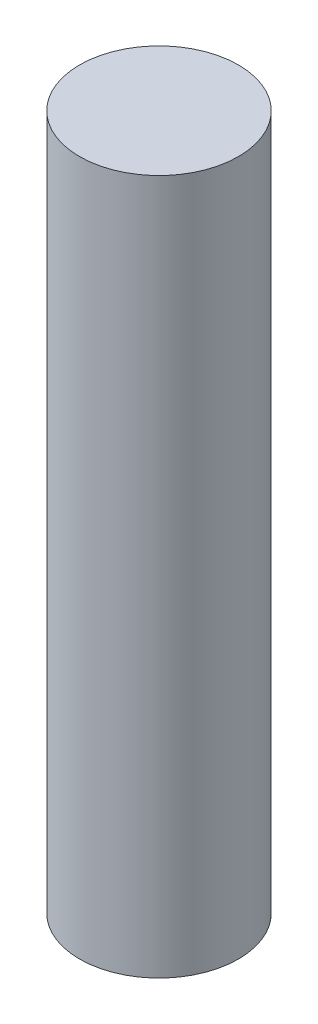
ISO-10303-21;
HEADER;
FILE_DESCRIPTION(('STEP AP214'),'2;1');
FILE_NAME('part.step','',(''),(''),'','','');
FILE_SCHEMA(('AUTOMOTIVE_DESIGN { 1 0 10303 214 1 1 1 1 }'));
ENDSEC;
DATA;
#1=APPLICATION_CONTEXT('core data for automotive mechanical design processes');
#2=APPLICATION_PROTOCOL_DEFINITION('international standard','automotive_design',2000,#1);
#3=PRODUCT_CONTEXT('',#1,'mechanical');
#4=PRODUCT('Part','Part','',(#3));
#5=PRODUCT_RELATED_PRODUCT_CATEGORY('part','',(#4));
#6=PRODUCT_DEFINITION_FORMATION('','',#4);
#7=PRODUCT_DEFINITION_CONTEXT('part definition',#1,'design');
#8=PRODUCT_DEFINITION('design','',#6,#7);
#9=PRODUCT_DEFINITION_SHAPE('','',#8);
#10=(LENGTH_UNIT() NAMED_UNIT(*) SI_UNIT(.MILLI.,.METRE.));
#11=(NAMED_UNIT(*) PLANE_ANGLE_UNIT() SI_UNIT($,.RADIAN.));
#12=(NAMED_UNIT(*) SI_UNIT($,.STERADIAN.) SOLID_ANGLE_UNIT());
#13=UNCERTAINTY_MEASURE_WITH_UNIT(LENGTH_MEASURE(1.E-05),#10,'distance_accuracy_value','');
#14=(GEOMETRIC_REPRESENTATION_CONTEXT(3) GLOBAL_UNCERTAINTY_ASSIGNED_CONTEXT((#13)) GLOBAL_UNIT_ASSIGNED_CONTEXT((#10,
#11,#12)) REPRESENTATION_CONTEXT('',''));
#15=CARTESIAN_POINT('',(0.,0.,0.));
#16=DIRECTION('',(0.,0.,1.));
#17=DIRECTION('',(1.,0.,0.));
#18=AXIS2_PLACEMENT_3D('',#15,#16,#17);
#19=CARTESIAN_POINT('',(0.,889.,0.));
#20=DIRECTION('',(0.,-1.,0.));
#21=DIRECTION('',(0.,0.,-1.));
#22=AXIS2_PLACEMENT_3D('',#19,#20,#21);
#23=CYLINDRICAL_SURFACE('',#22,101.6);
#24=CARTESIAN_POINT('',(0.,889.,0.));
#25=DIRECTION('',(0.,1.,0.));
#26=DIRECTION('',(0.,0.,1.));
#27=AXIS2_PLACEMENT_3D('',#24,#25,#26);
#28=CIRCLE('',#27,101.6);
#29=CARTESIAN_POINT('',(0.,889.,101.6));
#30=VERTEX_POINT('',#29);
#31=EDGE_CURVE('E10',#30,#30,#28,.T.);
#32=ORIENTED_EDGE('',*,*,#31,.F.);
#33=EDGE_LOOP('',(#32));
#34=FACE_BOUND('',#33,.T.);
#35=CARTESIAN_POINT('',(0.,0.,0.));
#36=DIRECTION('',(0.,1.,0.));
#37=DIRECTION('',(0.,0.,1.));
#38=AXIS2_PLACEMENT_3D('',#35,#36,#37);
#39=CIRCLE('',#38,101.6);
#40=CARTESIAN_POINT('',(0.,0.,101.6));
#41=VERTEX_POINT('',#40);
#42=EDGE_CURVE('E34',#41,#41,#39,.T.);
#43=ORIENTED_EDGE('',*,*,#42,.T.);
#44=EDGE_LOOP('',(#43));
#45=FACE_BOUND('',#44,.T.);
#46=ADVANCED_FACE('F31',(#34,#45),#23,.T.);
#47=CARTESIAN_POINT('',(0.,889.,0.));
#48=DIRECTION('',(0.,1.,0.));
#49=DIRECTION('',(0.,0.,1.));
#50=AXIS2_PLACEMENT_3D('',#47,#48,#49);
#51=PLANE('',#50);
#52=ORIENTED_EDGE('',*,*,#31,.T.);
#53=EDGE_LOOP('',(#52));
#54=FACE_BOUND('',#53,.T.);
#55=ADVANCED_FACE('F46',(#54),#51,.T.);
#56=CARTESIAN_POINT('',(0.,0.,0.));
#57=DIRECTION('',(0.,1.,0.));
#58=DIRECTION('',(0.,0.,1.));
#59=AXIS2_PLACEMENT_3D('',#56,#57,#58);
#60=PLANE('',#59);
#61=ORIENTED_EDGE('',*,*,#42,.F.);
#62=EDGE_LOOP('',(#61));
#63=FACE_BOUND('',#62,.T.);
#64=ADVANCED_FACE('F44',(#63),#60,.F.);
#65=CLOSED_SHELL('',(#46,#55,#64));
#66=MANIFOLD_SOLID_BREP('B2',#65);
#67=ADVANCED_BREP_SHAPE_REPRESENTATION('',(#18,#66),#14);
#68=SHAPE_DEFINITION_REPRESENTATION(#9,#67);
ENDSEC;
END-ISO-10303-21;
